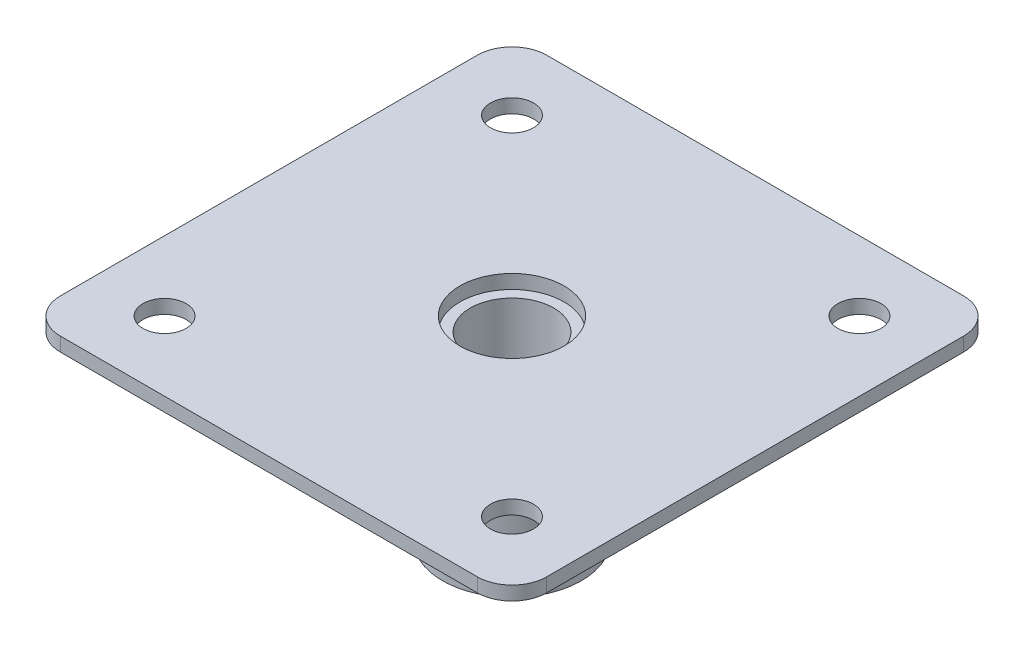
ISO-10303-21;
HEADER;
FILE_DESCRIPTION(('STEP AP214'),'2;1');
FILE_NAME('part.step','',(''),(''),'','','');
FILE_SCHEMA(('AUTOMOTIVE_DESIGN { 1 0 10303 214 1 1 1 1 }'));
ENDSEC;
DATA;
#1=APPLICATION_CONTEXT('core data for automotive mechanical design processes');
#2=APPLICATION_PROTOCOL_DEFINITION('international standard','automotive_design',2000,#1);
#3=PRODUCT_CONTEXT('',#1,'mechanical');
#4=PRODUCT('Part','Part','',(#3));
#5=PRODUCT_RELATED_PRODUCT_CATEGORY('part','',(#4));
#6=PRODUCT_DEFINITION_FORMATION('','',#4);
#7=PRODUCT_DEFINITION_CONTEXT('part definition',#1,'design');
#8=PRODUCT_DEFINITION('design','',#6,#7);
#9=PRODUCT_DEFINITION_SHAPE('','',#8);
#10=(LENGTH_UNIT() NAMED_UNIT(*) SI_UNIT(.MILLI.,.METRE.));
#11=(NAMED_UNIT(*) PLANE_ANGLE_UNIT() SI_UNIT($,.RADIAN.));
#12=(NAMED_UNIT(*) SI_UNIT($,.STERADIAN.) SOLID_ANGLE_UNIT());
#13=UNCERTAINTY_MEASURE_WITH_UNIT(LENGTH_MEASURE(1.E-05),#10,'distance_accuracy_value','');
#14=(GEOMETRIC_REPRESENTATION_CONTEXT(3) GLOBAL_UNCERTAINTY_ASSIGNED_CONTEXT((#13)) GLOBAL_UNIT_ASSIGNED_CONTEXT((#10,
#11,#12)) REPRESENTATION_CONTEXT('',''));
#15=CARTESIAN_POINT('',(0.,0.,0.));
#16=DIRECTION('',(0.,0.,1.));
#17=DIRECTION('',(1.,0.,0.));
#18=AXIS2_PLACEMENT_3D('',#15,#16,#17);
#19=CARTESIAN_POINT('',(0.,2.,0.));
#20=DIRECTION('',(0.,-1.,0.));
#21=DIRECTION('',(0.,0.,-1.));
#22=AXIS2_PLACEMENT_3D('',#19,#20,#21);
#23=CYLINDRICAL_SURFACE('',#22,6.);
#24=CARTESIAN_POINT('',(0.,-26.,0.));
#25=DIRECTION('',(0.,-1.,0.));
#26=DIRECTION('',(0.,0.,-1.));
#27=AXIS2_PLACEMENT_3D('',#24,#25,#26);
#28=CIRCLE('',#27,6.);
#29=CARTESIAN_POINT('',(0.,-26.,-6.));
#30=VERTEX_POINT('',#29);
#31=EDGE_CURVE('E209',#30,#30,#28,.T.);
#32=ORIENTED_EDGE('',*,*,#31,.T.);
#33=EDGE_LOOP('',(#32));
#34=FACE_BOUND('',#33,.T.);
#35=CARTESIAN_POINT('',(0.,0.,0.));
#36=DIRECTION('',(0.,1.,0.));
#37=DIRECTION('',(0.,0.,1.));
#38=AXIS2_PLACEMENT_3D('',#35,#36,#37);
#39=CIRCLE('',#38,6.);
#40=CARTESIAN_POINT('',(0.,0.,6.));
#41=VERTEX_POINT('',#40);
#42=EDGE_CURVE('E40',#41,#41,#39,.F.);
#43=ORIENTED_EDGE('',*,*,#42,.F.);
#44=EDGE_LOOP('',(#43));
#45=FACE_BOUND('',#44,.T.);
#46=ADVANCED_FACE('F36',(#34,#45),#23,.F.);
#47=CARTESIAN_POINT('',(0.,2.,0.));
#48=DIRECTION('',(0.,-1.,0.));
#49=DIRECTION('',(0.,0.,-1.));
#50=AXIS2_PLACEMENT_3D('',#47,#48,#49);
#51=PLANE('',#50);
#52=CARTESIAN_POINT('',(0.,2.,0.));
#53=DIRECTION('',(0.,1.,0.));
#54=DIRECTION('',(0.,0.,1.));
#55=AXIS2_PLACEMENT_3D('',#52,#53,#54);
#56=CIRCLE('',#55,7.5);
#57=CARTESIAN_POINT('',(0.,2.,7.5));
#58=VERTEX_POINT('',#57);
#59=EDGE_CURVE('E214',#58,#58,#56,.T.);
#60=ORIENTED_EDGE('',*,*,#59,.F.);
#61=EDGE_LOOP('',(#60));
#62=FACE_BOUND('',#61,.T.);
#63=DIRECTION('',(0.,0.,-1.));
#64=VECTOR('',#63,1.);
#65=CARTESIAN_POINT('',(35.,2.,35.));
#66=LINE('',#65,#64);
#67=CARTESIAN_POINT('',(35.,2.,30.));
#68=VERTEX_POINT('',#67);
#69=CARTESIAN_POINT('',(35.,2.,-30.));
#70=VERTEX_POINT('',#69);
#71=EDGE_CURVE('E141',#68,#70,#66,.T.);
#72=ORIENTED_EDGE('',*,*,#71,.T.);
#73=CARTESIAN_POINT('',(30.,2.,-30.));
#74=DIRECTION('',(0.,-1.,0.));
#75=DIRECTION('',(0.,0.,-1.));
#76=AXIS2_PLACEMENT_3D('',#73,#74,#75);
#77=CIRCLE('',#76,5.);
#78=CARTESIAN_POINT('',(30.,2.,-35.));
#79=VERTEX_POINT('',#78);
#80=EDGE_CURVE('E156',#70,#79,#77,.F.);
#81=ORIENTED_EDGE('',*,*,#80,.T.);
#82=DIRECTION('',(-1.,0.,0.));
#83=VECTOR('',#82,1.);
#84=CARTESIAN_POINT('',(-35.,2.,-35.));
#85=LINE('',#84,#83);
#86=CARTESIAN_POINT('',(-30.,2.,-35.));
#87=VERTEX_POINT('',#86);
#88=EDGE_CURVE('E123',#79,#87,#85,.T.);
#89=ORIENTED_EDGE('',*,*,#88,.T.);
#90=CARTESIAN_POINT('',(-30.,2.,-30.));
#91=DIRECTION('',(0.,-1.,0.));
#92=DIRECTION('',(0.,0.,-1.));
#93=AXIS2_PLACEMENT_3D('',#90,#91,#92);
#94=CIRCLE('',#93,5.);
#95=CARTESIAN_POINT('',(-35.,2.,-30.));
#96=VERTEX_POINT('',#95);
#97=EDGE_CURVE('E154',#87,#96,#94,.F.);
#98=ORIENTED_EDGE('',*,*,#97,.T.);
#99=DIRECTION('',(0.,0.,1.));
#100=VECTOR('',#99,1.);
#101=CARTESIAN_POINT('',(-35.,2.,35.));
#102=LINE('',#101,#100);
#103=CARTESIAN_POINT('',(-35.,2.,30.));
#104=VERTEX_POINT('',#103);
#105=EDGE_CURVE('E168',#96,#104,#102,.T.);
#106=ORIENTED_EDGE('',*,*,#105,.T.);
#107=CARTESIAN_POINT('',(-30.,2.,30.));
#108=DIRECTION('',(0.,-1.,0.));
#109=DIRECTION('',(0.,0.,-1.));
#110=AXIS2_PLACEMENT_3D('',#107,#108,#109);
#111=CIRCLE('',#110,5.);
#112=CARTESIAN_POINT('',(-30.,2.,35.));
#113=VERTEX_POINT('',#112);
#114=EDGE_CURVE('E58',#104,#113,#111,.F.);
#115=ORIENTED_EDGE('',*,*,#114,.T.);
#116=DIRECTION('',(1.,0.,0.));
#117=VECTOR('',#116,1.);
#118=CARTESIAN_POINT('',(-35.,2.,35.));
#119=LINE('',#118,#117);
#120=CARTESIAN_POINT('',(30.,2.,35.));
#121=VERTEX_POINT('',#120);
#122=EDGE_CURVE('E142',#113,#121,#119,.T.);
#123=ORIENTED_EDGE('',*,*,#122,.T.);
#124=CARTESIAN_POINT('',(30.,2.,30.));
#125=DIRECTION('',(0.,-1.,0.));
#126=DIRECTION('',(0.,0.,-1.));
#127=AXIS2_PLACEMENT_3D('',#124,#125,#126);
#128=CIRCLE('',#127,5.);
#129=EDGE_CURVE('E151',#121,#68,#128,.F.);
#130=ORIENTED_EDGE('',*,*,#129,.T.);
#131=EDGE_LOOP('',(#72,#81,#89,#98,#106,#115,#123,#130));
#132=FACE_BOUND('',#131,.T.);
#133=CARTESIAN_POINT('',(25.,2.,-25.));
#134=DIRECTION('',(0.,1.,0.));
#135=DIRECTION('',(0.,0.,1.));
#136=AXIS2_PLACEMENT_3D('',#133,#134,#135);
#137=CIRCLE('',#136,3.1);
#138=CARTESIAN_POINT('',(25.,2.,-21.9));
#139=VERTEX_POINT('',#138);
#140=EDGE_CURVE('E136',#139,#139,#137,.T.);
#141=ORIENTED_EDGE('',*,*,#140,.F.);
#142=EDGE_LOOP('',(#141));
#143=FACE_BOUND('',#142,.T.);
#144=CARTESIAN_POINT('',(-25.,2.,25.));
#145=DIRECTION('',(0.,1.,0.));
#146=DIRECTION('',(0.,0.,-1.));
#147=AXIS2_PLACEMENT_3D('',#144,#145,#146);
#148=CIRCLE('',#147,3.09999999999999);
#149=CARTESIAN_POINT('',(-25.,2.,21.9));
#150=VERTEX_POINT('',#149);
#151=EDGE_CURVE('E185',#150,#150,#148,.T.);
#152=ORIENTED_EDGE('',*,*,#151,.F.);
#153=EDGE_LOOP('',(#152));
#154=FACE_BOUND('',#153,.T.);
#155=CARTESIAN_POINT('',(-25.,2.,-25.));
#156=DIRECTION('',(0.,1.,0.));
#157=DIRECTION('',(0.,0.,1.));
#158=AXIS2_PLACEMENT_3D('',#155,#156,#157);
#159=CIRCLE('',#158,3.09999999999999);
#160=CARTESIAN_POINT('',(-25.,2.,-21.9));
#161=VERTEX_POINT('',#160);
#162=EDGE_CURVE('E191',#161,#161,#159,.T.);
#163=ORIENTED_EDGE('',*,*,#162,.F.);
#164=EDGE_LOOP('',(#163));
#165=FACE_BOUND('',#164,.T.);
#166=CARTESIAN_POINT('',(25.,2.,25.));
#167=DIRECTION('',(0.,1.,0.));
#168=DIRECTION('',(0.,0.,-1.));
#169=AXIS2_PLACEMENT_3D('',#166,#167,#168);
#170=CIRCLE('',#169,3.1);
#171=CARTESIAN_POINT('',(25.,2.,21.9));
#172=VERTEX_POINT('',#171);
#173=EDGE_CURVE('E197',#172,#172,#170,.T.);
#174=ORIENTED_EDGE('',*,*,#173,.F.);
#175=EDGE_LOOP('',(#174));
#176=FACE_BOUND('',#175,.T.);
#177=ADVANCED_FACE('F227',(#62,#132,#143,#154,#165,#176),#51,.F.);
#178=CARTESIAN_POINT('',(0.,0.,0.));
#179=DIRECTION('',(0.,-1.,0.));
#180=DIRECTION('',(0.,0.,-1.));
#181=AXIS2_PLACEMENT_3D('',#178,#179,#180);
#182=PLANE('',#181);
#183=CARTESIAN_POINT('',(0.,0.,0.));
#184=DIRECTION('',(0.,-1.,0.));
#185=DIRECTION('',(0.,0.,-1.));
#186=AXIS2_PLACEMENT_3D('',#183,#184,#185);
#187=CIRCLE('',#186,10.);
#188=CARTESIAN_POINT('',(0.,0.,-10.));
#189=VERTEX_POINT('',#188);
#190=EDGE_CURVE('E206',#189,#189,#187,.T.);
#191=ORIENTED_EDGE('',*,*,#190,.F.);
#192=EDGE_LOOP('',(#191));
#193=FACE_BOUND('',#192,.T.);
#194=CARTESIAN_POINT('',(-25.,0.,-25.));
#195=DIRECTION('',(0.,1.,0.));
#196=DIRECTION('',(0.,0.,1.));
#197=AXIS2_PLACEMENT_3D('',#194,#195,#196);
#198=CIRCLE('',#197,3.09999999999999);
#199=CARTESIAN_POINT('',(-25.,0.,-21.9));
#200=VERTEX_POINT('',#199);
#201=EDGE_CURVE('E194',#200,#200,#198,.T.);
#202=ORIENTED_EDGE('',*,*,#201,.T.);
#203=EDGE_LOOP('',(#202));
#204=FACE_BOUND('',#203,.T.);
#205=CARTESIAN_POINT('',(25.,0.,-25.));
#206=DIRECTION('',(0.,1.,0.));
#207=DIRECTION('',(0.,0.,1.));
#208=AXIS2_PLACEMENT_3D('',#205,#206,#207);
#209=CIRCLE('',#208,3.1);
#210=CARTESIAN_POINT('',(25.,0.,-21.9));
#211=VERTEX_POINT('',#210);
#212=EDGE_CURVE('E182',#211,#211,#209,.T.);
#213=ORIENTED_EDGE('',*,*,#212,.T.);
#214=EDGE_LOOP('',(#213));
#215=FACE_BOUND('',#214,.T.);
#216=DIRECTION('',(-1.,0.,0.));
#217=VECTOR('',#216,1.);
#218=CARTESIAN_POINT('',(-35.,0.,-35.));
#219=LINE('',#218,#217);
#220=CARTESIAN_POINT('',(30.,0.,-35.));
#221=VERTEX_POINT('',#220);
#222=CARTESIAN_POINT('',(-30.,0.,-35.));
#223=VERTEX_POINT('',#222);
#224=EDGE_CURVE('E120',#221,#223,#219,.T.);
#225=ORIENTED_EDGE('',*,*,#224,.F.);
#226=CARTESIAN_POINT('',(30.,0.,-30.));
#227=DIRECTION('',(0.,-1.,0.));
#228=DIRECTION('',(0.,0.,-1.));
#229=AXIS2_PLACEMENT_3D('',#226,#227,#228);
#230=CIRCLE('',#229,5.);
#231=CARTESIAN_POINT('',(35.,0.,-30.));
#232=VERTEX_POINT('',#231);
#233=EDGE_CURVE('E103',#221,#232,#230,.T.);
#234=ORIENTED_EDGE('',*,*,#233,.T.);
#235=DIRECTION('',(0.,0.,-1.));
#236=VECTOR('',#235,1.);
#237=CARTESIAN_POINT('',(35.,0.,35.));
#238=LINE('',#237,#236);
#239=CARTESIAN_POINT('',(35.,0.,30.));
#240=VERTEX_POINT('',#239);
#241=EDGE_CURVE('E131',#240,#232,#238,.T.);
#242=ORIENTED_EDGE('',*,*,#241,.F.);
#243=CARTESIAN_POINT('',(30.,0.,30.));
#244=DIRECTION('',(0.,-1.,0.));
#245=DIRECTION('',(0.,0.,-1.));
#246=AXIS2_PLACEMENT_3D('',#243,#244,#245);
#247=CIRCLE('',#246,5.);
#248=CARTESIAN_POINT('',(30.,0.,35.));
#249=VERTEX_POINT('',#248);
#250=EDGE_CURVE('E124',#240,#249,#247,.T.);
#251=ORIENTED_EDGE('',*,*,#250,.T.);
#252=DIRECTION('',(1.,0.,0.));
#253=VECTOR('',#252,1.);
#254=CARTESIAN_POINT('',(-35.,0.,35.));
#255=LINE('',#254,#253);
#256=CARTESIAN_POINT('',(-30.,0.,35.));
#257=VERTEX_POINT('',#256);
#258=EDGE_CURVE('E134',#257,#249,#255,.T.);
#259=ORIENTED_EDGE('',*,*,#258,.F.);
#260=CARTESIAN_POINT('',(-30.,0.,30.));
#261=DIRECTION('',(0.,-1.,0.));
#262=DIRECTION('',(0.,0.,-1.));
#263=AXIS2_PLACEMENT_3D('',#260,#261,#262);
#264=CIRCLE('',#263,5.);
#265=CARTESIAN_POINT('',(-35.,0.,30.));
#266=VERTEX_POINT('',#265);
#267=EDGE_CURVE('E145',#257,#266,#264,.T.);
#268=ORIENTED_EDGE('',*,*,#267,.T.);
#269=DIRECTION('',(0.,0.,1.));
#270=VECTOR('',#269,1.);
#271=CARTESIAN_POINT('',(-35.,0.,35.));
#272=LINE('',#271,#270);
#273=CARTESIAN_POINT('',(-35.,0.,-30.));
#274=VERTEX_POINT('',#273);
#275=EDGE_CURVE('E130',#274,#266,#272,.T.);
#276=ORIENTED_EDGE('',*,*,#275,.F.);
#277=CARTESIAN_POINT('',(-30.,0.,-30.));
#278=DIRECTION('',(0.,-1.,0.));
#279=DIRECTION('',(0.,0.,-1.));
#280=AXIS2_PLACEMENT_3D('',#277,#278,#279);
#281=CIRCLE('',#280,5.);
#282=EDGE_CURVE('E114',#274,#223,#281,.T.);
#283=ORIENTED_EDGE('',*,*,#282,.T.);
#284=EDGE_LOOP('',(#225,#234,#242,#251,#259,#268,#276,#283));
#285=FACE_BOUND('',#284,.T.);
#286=CARTESIAN_POINT('',(-25.,0.,25.));
#287=DIRECTION('',(0.,1.,0.));
#288=DIRECTION('',(0.,0.,-1.));
#289=AXIS2_PLACEMENT_3D('',#286,#287,#288);
#290=CIRCLE('',#289,3.09999999999999);
#291=CARTESIAN_POINT('',(-25.,0.,21.9));
#292=VERTEX_POINT('',#291);
#293=EDGE_CURVE('E188',#292,#292,#290,.T.);
#294=ORIENTED_EDGE('',*,*,#293,.T.);
#295=EDGE_LOOP('',(#294));
#296=FACE_BOUND('',#295,.T.);
#297=CARTESIAN_POINT('',(25.,0.,25.));
#298=DIRECTION('',(0.,1.,0.));
#299=DIRECTION('',(0.,0.,-1.));
#300=AXIS2_PLACEMENT_3D('',#297,#298,#299);
#301=CIRCLE('',#300,3.1);
#302=CARTESIAN_POINT('',(25.,0.,21.9));
#303=VERTEX_POINT('',#302);
#304=EDGE_CURVE('E200',#303,#303,#301,.T.);
#305=ORIENTED_EDGE('',*,*,#304,.T.);
#306=EDGE_LOOP('',(#305));
#307=FACE_BOUND('',#306,.T.);
#308=ADVANCED_FACE('F127',(#193,#204,#215,#285,#296,#307),#182,.T.);
#309=CARTESIAN_POINT('',(35.,2.,35.));
#310=DIRECTION('',(-1.,0.,0.));
#311=DIRECTION('',(0.,0.,1.));
#312=AXIS2_PLACEMENT_3D('',#309,#310,#311);
#313=PLANE('',#312);
#314=ORIENTED_EDGE('',*,*,#241,.T.);
#315=DIRECTION('',(0.,-1.,0.));
#316=VECTOR('',#315,1.);
#317=CARTESIAN_POINT('',(35.,2.,-30.));
#318=LINE('',#317,#316);
#319=EDGE_CURVE('E108',#232,#70,#318,.F.);
#320=ORIENTED_EDGE('',*,*,#319,.T.);
#321=ORIENTED_EDGE('',*,*,#71,.F.);
#322=DIRECTION('',(0.,-1.,0.));
#323=VECTOR('',#322,1.);
#324=CARTESIAN_POINT('',(35.,2.,30.));
#325=LINE('',#324,#323);
#326=EDGE_CURVE('E113',#68,#240,#325,.T.);
#327=ORIENTED_EDGE('',*,*,#326,.T.);
#328=EDGE_LOOP('',(#314,#320,#321,#327));
#329=FACE_BOUND('',#328,.T.);
#330=ADVANCED_FACE('F265',(#329),#313,.F.);
#331=CARTESIAN_POINT('',(-35.,2.,-35.));
#332=DIRECTION('',(0.,0.,1.));
#333=DIRECTION('',(1.,0.,0.));
#334=AXIS2_PLACEMENT_3D('',#331,#332,#333);
#335=PLANE('',#334);
#336=ORIENTED_EDGE('',*,*,#88,.F.);
#337=DIRECTION('',(0.,-1.,0.));
#338=VECTOR('',#337,1.);
#339=CARTESIAN_POINT('',(30.,2.,-35.));
#340=LINE('',#339,#338);
#341=EDGE_CURVE('E107',#79,#221,#340,.T.);
#342=ORIENTED_EDGE('',*,*,#341,.T.);
#343=ORIENTED_EDGE('',*,*,#224,.T.);
#344=DIRECTION('',(0.,-1.,0.));
#345=VECTOR('',#344,1.);
#346=CARTESIAN_POINT('',(-30.,2.,-35.));
#347=LINE('',#346,#345);
#348=EDGE_CURVE('E125',#223,#87,#347,.F.);
#349=ORIENTED_EDGE('',*,*,#348,.T.);
#350=EDGE_LOOP('',(#336,#342,#343,#349));
#351=FACE_BOUND('',#350,.T.);
#352=ADVANCED_FACE('F119',(#351),#335,.F.);
#353=CARTESIAN_POINT('',(-35.,2.,35.));
#354=DIRECTION('',(1.,0.,0.));
#355=DIRECTION('',(0.,0.,-1.));
#356=AXIS2_PLACEMENT_3D('',#353,#354,#355);
#357=PLANE('',#356);
#358=ORIENTED_EDGE('',*,*,#105,.F.);
#359=DIRECTION('',(0.,-1.,0.));
#360=VECTOR('',#359,1.);
#361=CARTESIAN_POINT('',(-35.,2.,-30.));
#362=LINE('',#361,#360);
#363=EDGE_CURVE('E160',#96,#274,#362,.T.);
#364=ORIENTED_EDGE('',*,*,#363,.T.);
#365=ORIENTED_EDGE('',*,*,#275,.T.);
#366=DIRECTION('',(0.,-1.,0.));
#367=VECTOR('',#366,1.);
#368=CARTESIAN_POINT('',(-35.,2.,30.));
#369=LINE('',#368,#367);
#370=EDGE_CURVE('E158',#266,#104,#369,.F.);
#371=ORIENTED_EDGE('',*,*,#370,.T.);
#372=EDGE_LOOP('',(#358,#364,#365,#371));
#373=FACE_BOUND('',#372,.T.);
#374=ADVANCED_FACE('F166',(#373),#357,.F.);
#375=CARTESIAN_POINT('',(-35.,2.,35.));
#376=DIRECTION('',(0.,0.,-1.));
#377=DIRECTION('',(-1.,0.,0.));
#378=AXIS2_PLACEMENT_3D('',#375,#376,#377);
#379=PLANE('',#378);
#380=ORIENTED_EDGE('',*,*,#122,.F.);
#381=DIRECTION('',(0.,-1.,0.));
#382=VECTOR('',#381,1.);
#383=CARTESIAN_POINT('',(-30.,2.,35.));
#384=LINE('',#383,#382);
#385=EDGE_CURVE('E12',#113,#257,#384,.T.);
#386=ORIENTED_EDGE('',*,*,#385,.T.);
#387=ORIENTED_EDGE('',*,*,#258,.T.);
#388=DIRECTION('',(0.,-1.,0.));
#389=VECTOR('',#388,1.);
#390=CARTESIAN_POINT('',(30.,2.,35.));
#391=LINE('',#390,#389);
#392=EDGE_CURVE('E45',#249,#121,#391,.F.);
#393=ORIENTED_EDGE('',*,*,#392,.T.);
#394=EDGE_LOOP('',(#380,#386,#387,#393));
#395=FACE_BOUND('',#394,.T.);
#396=ADVANCED_FACE('F175',(#395),#379,.F.);
#397=CARTESIAN_POINT('',(25.,2.,-25.));
#398=DIRECTION('',(0.,-1.,0.));
#399=DIRECTION('',(0.,0.,-1.));
#400=AXIS2_PLACEMENT_3D('',#397,#398,#399);
#401=CYLINDRICAL_SURFACE('',#400,3.1);
#402=ORIENTED_EDGE('',*,*,#140,.T.);
#403=EDGE_LOOP('',(#402));
#404=FACE_BOUND('',#403,.T.);
#405=ORIENTED_EDGE('',*,*,#212,.F.);
#406=EDGE_LOOP('',(#405));
#407=FACE_BOUND('',#406,.T.);
#408=ADVANCED_FACE('F258',(#404,#407),#401,.F.);
#409=CARTESIAN_POINT('',(-25.,2.,25.));
#410=DIRECTION('',(0.,-1.,0.));
#411=DIRECTION('',(0.,0.,-1.));
#412=AXIS2_PLACEMENT_3D('',#409,#410,#411);
#413=CYLINDRICAL_SURFACE('',#412,3.09999999999999);
#414=ORIENTED_EDGE('',*,*,#151,.T.);
#415=EDGE_LOOP('',(#414));
#416=FACE_BOUND('',#415,.T.);
#417=ORIENTED_EDGE('',*,*,#293,.F.);
#418=EDGE_LOOP('',(#417));
#419=FACE_BOUND('',#418,.T.);
#420=ADVANCED_FACE('F254',(#416,#419),#413,.F.);
#421=CARTESIAN_POINT('',(-25.,2.,-25.));
#422=DIRECTION('',(0.,-1.,0.));
#423=DIRECTION('',(0.,0.,-1.));
#424=AXIS2_PLACEMENT_3D('',#421,#422,#423);
#425=CYLINDRICAL_SURFACE('',#424,3.09999999999999);
#426=ORIENTED_EDGE('',*,*,#162,.T.);
#427=EDGE_LOOP('',(#426));
#428=FACE_BOUND('',#427,.T.);
#429=ORIENTED_EDGE('',*,*,#201,.F.);
#430=EDGE_LOOP('',(#429));
#431=FACE_BOUND('',#430,.T.);
#432=ADVANCED_FACE('F250',(#428,#431),#425,.F.);
#433=CARTESIAN_POINT('',(25.,2.,25.));
#434=DIRECTION('',(0.,-1.,0.));
#435=DIRECTION('',(0.,0.,-1.));
#436=AXIS2_PLACEMENT_3D('',#433,#434,#435);
#437=CYLINDRICAL_SURFACE('',#436,3.1);
#438=ORIENTED_EDGE('',*,*,#173,.T.);
#439=EDGE_LOOP('',(#438));
#440=FACE_BOUND('',#439,.T.);
#441=ORIENTED_EDGE('',*,*,#304,.F.);
#442=EDGE_LOOP('',(#441));
#443=FACE_BOUND('',#442,.T.);
#444=ADVANCED_FACE('F247',(#440,#443),#437,.F.);
#445=CARTESIAN_POINT('',(30.,2.,-30.));
#446=DIRECTION('',(0.,-1.,0.));
#447=DIRECTION('',(0.,0.,-1.));
#448=AXIS2_PLACEMENT_3D('',#445,#446,#447);
#449=CYLINDRICAL_SURFACE('',#448,5.);
#450=ORIENTED_EDGE('',*,*,#80,.F.);
#451=ORIENTED_EDGE('',*,*,#319,.F.);
#452=ORIENTED_EDGE('',*,*,#233,.F.);
#453=ORIENTED_EDGE('',*,*,#341,.F.);
#454=EDGE_LOOP('',(#450,#451,#452,#453));
#455=FACE_BOUND('',#454,.T.);
#456=ADVANCED_FACE('F106',(#455),#449,.T.);
#457=CARTESIAN_POINT('',(-30.,2.,-30.));
#458=DIRECTION('',(0.,-1.,0.));
#459=DIRECTION('',(0.,0.,-1.));
#460=AXIS2_PLACEMENT_3D('',#457,#458,#459);
#461=CYLINDRICAL_SURFACE('',#460,5.);
#462=ORIENTED_EDGE('',*,*,#97,.F.);
#463=ORIENTED_EDGE('',*,*,#348,.F.);
#464=ORIENTED_EDGE('',*,*,#282,.F.);
#465=ORIENTED_EDGE('',*,*,#363,.F.);
#466=EDGE_LOOP('',(#462,#463,#464,#465));
#467=FACE_BOUND('',#466,.T.);
#468=ADVANCED_FACE('F278',(#467),#461,.T.);
#469=CARTESIAN_POINT('',(-30.,2.,30.));
#470=DIRECTION('',(0.,-1.,0.));
#471=DIRECTION('',(0.,0.,-1.));
#472=AXIS2_PLACEMENT_3D('',#469,#470,#471);
#473=CYLINDRICAL_SURFACE('',#472,5.);
#474=ORIENTED_EDGE('',*,*,#114,.F.);
#475=ORIENTED_EDGE('',*,*,#370,.F.);
#476=ORIENTED_EDGE('',*,*,#267,.F.);
#477=ORIENTED_EDGE('',*,*,#385,.F.);
#478=EDGE_LOOP('',(#474,#475,#476,#477));
#479=FACE_BOUND('',#478,.T.);
#480=ADVANCED_FACE('F174',(#479),#473,.T.);
#481=CARTESIAN_POINT('',(30.,2.,30.));
#482=DIRECTION('',(0.,-1.,0.));
#483=DIRECTION('',(0.,0.,-1.));
#484=AXIS2_PLACEMENT_3D('',#481,#482,#483);
#485=CYLINDRICAL_SURFACE('',#484,5.);
#486=ORIENTED_EDGE('',*,*,#129,.F.);
#487=ORIENTED_EDGE('',*,*,#392,.F.);
#488=ORIENTED_EDGE('',*,*,#250,.F.);
#489=ORIENTED_EDGE('',*,*,#326,.F.);
#490=EDGE_LOOP('',(#486,#487,#488,#489));
#491=FACE_BOUND('',#490,.T.);
#492=ADVANCED_FACE('F38',(#491),#485,.T.);
#493=CARTESIAN_POINT('',(0.,-26.,0.));
#494=DIRECTION('',(0.,1.,0.));
#495=DIRECTION('',(0.,0.,1.));
#496=AXIS2_PLACEMENT_3D('',#493,#494,#495);
#497=CYLINDRICAL_SURFACE('',#496,10.);
#498=CARTESIAN_POINT('',(0.,-26.,0.));
#499=DIRECTION('',(0.,-1.,0.));
#500=DIRECTION('',(0.,0.,-1.));
#501=AXIS2_PLACEMENT_3D('',#498,#499,#500);
#502=CIRCLE('',#501,10.);
#503=CARTESIAN_POINT('',(0.,-26.,-10.));
#504=VERTEX_POINT('',#503);
#505=EDGE_CURVE('E203',#504,#504,#502,.T.);
#506=ORIENTED_EDGE('',*,*,#505,.F.);
#507=EDGE_LOOP('',(#506));
#508=FACE_BOUND('',#507,.T.);
#509=ORIENTED_EDGE('',*,*,#190,.T.);
#510=EDGE_LOOP('',(#509));
#511=FACE_BOUND('',#510,.T.);
#512=ADVANCED_FACE('F242',(#508,#511),#497,.T.);
#513=CARTESIAN_POINT('',(0.,-26.,0.));
#514=DIRECTION('',(0.,-1.,0.));
#515=DIRECTION('',(0.,0.,-1.));
#516=AXIS2_PLACEMENT_3D('',#513,#514,#515);
#517=PLANE('',#516);
#518=ORIENTED_EDGE('',*,*,#31,.F.);
#519=EDGE_LOOP('',(#518));
#520=FACE_BOUND('',#519,.T.);
#521=ORIENTED_EDGE('',*,*,#505,.T.);
#522=EDGE_LOOP('',(#521));
#523=FACE_BOUND('',#522,.T.);
#524=ADVANCED_FACE('F239',(#520,#523),#517,.T.);
#525=CARTESIAN_POINT('',(0.,0.,0.));
#526=DIRECTION('',(0.,1.,0.));
#527=DIRECTION('',(0.,0.,1.));
#528=AXIS2_PLACEMENT_3D('',#525,#526,#527);
#529=PLANE('',#528);
#530=CARTESIAN_POINT('',(0.,0.,0.));
#531=DIRECTION('',(0.,1.,0.));
#532=DIRECTION('',(0.,0.,1.));
#533=AXIS2_PLACEMENT_3D('',#530,#531,#532);
#534=CIRCLE('',#533,7.5);
#535=CARTESIAN_POINT('',(0.,0.,7.5));
#536=VERTEX_POINT('',#535);
#537=EDGE_CURVE('E217',#536,#536,#534,.T.);
#538=ORIENTED_EDGE('',*,*,#537,.T.);
#539=EDGE_LOOP('',(#538));
#540=FACE_BOUND('',#539,.T.);
#541=ORIENTED_EDGE('',*,*,#42,.T.);
#542=EDGE_LOOP('',(#541));
#543=FACE_BOUND('',#542,.T.);
#544=ADVANCED_FACE('F224',(#540,#543),#529,.T.);
#545=CARTESIAN_POINT('',(0.,0.,0.));
#546=DIRECTION('',(0.,1.,0.));
#547=DIRECTION('',(0.,0.,1.));
#548=AXIS2_PLACEMENT_3D('',#545,#546,#547);
#549=CYLINDRICAL_SURFACE('',#548,7.5);
#550=ORIENTED_EDGE('',*,*,#537,.F.);
#551=EDGE_LOOP('',(#550));
#552=FACE_BOUND('',#551,.T.);
#553=ORIENTED_EDGE('',*,*,#59,.T.);
#554=EDGE_LOOP('',(#553));
#555=FACE_BOUND('',#554,.T.);
#556=ADVANCED_FACE('F237',(#552,#555),#549,.F.);
#557=CLOSED_SHELL('',(#46,#177,#308,#330,#352,#374,#396,#408,#420,#432,#444,#456,#468,#480,#492,
#512,#524,#544,#556));
#558=MANIFOLD_SOLID_BREP('B2',#557);
#559=ADVANCED_BREP_SHAPE_REPRESENTATION('',(#18,#558),#14);
#560=SHAPE_DEFINITION_REPRESENTATION(#9,#559);
ENDSEC;
END-ISO-10303-21;
